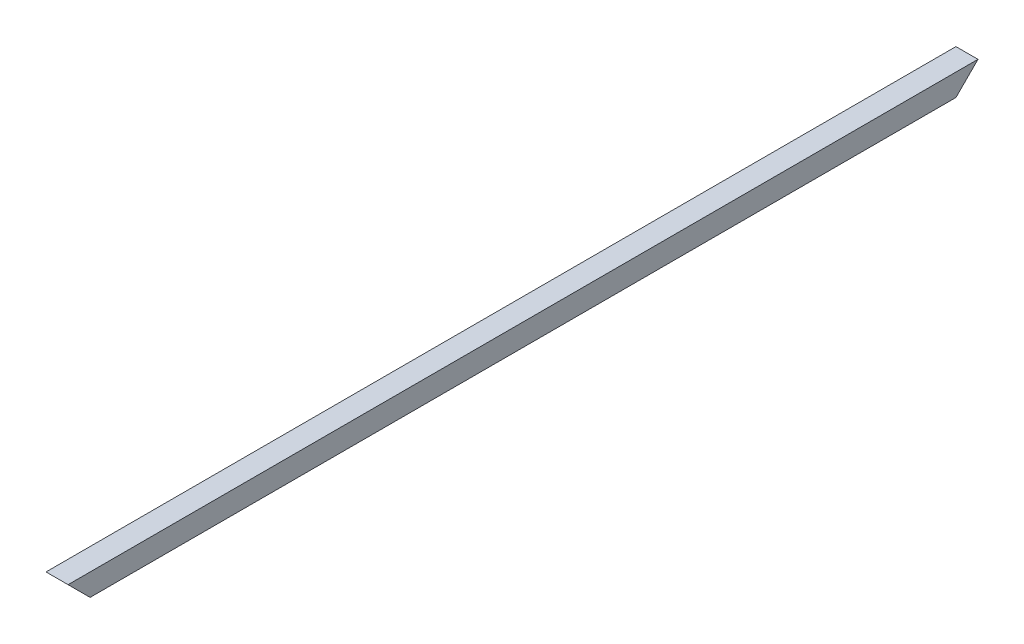
ISO-10303-21;
HEADER;
FILE_DESCRIPTION(('STEP AP214'),'2;1');
FILE_NAME('part.step','',(''),(''),'','','');
FILE_SCHEMA(('AUTOMOTIVE_DESIGN { 1 0 10303 214 1 1 1 1 }'));
ENDSEC;
DATA;
#1=APPLICATION_CONTEXT('core data for automotive mechanical design processes');
#2=APPLICATION_PROTOCOL_DEFINITION('international standard','automotive_design',2000,#1);
#3=PRODUCT_CONTEXT('',#1,'mechanical');
#4=PRODUCT('Part','Part','',(#3));
#5=PRODUCT_RELATED_PRODUCT_CATEGORY('part','',(#4));
#6=PRODUCT_DEFINITION_FORMATION('','',#4);
#7=PRODUCT_DEFINITION_CONTEXT('part definition',#1,'design');
#8=PRODUCT_DEFINITION('design','',#6,#7);
#9=PRODUCT_DEFINITION_SHAPE('','',#8);
#10=(LENGTH_UNIT() NAMED_UNIT(*) SI_UNIT(.MILLI.,.METRE.));
#11=(NAMED_UNIT(*) PLANE_ANGLE_UNIT() SI_UNIT($,.RADIAN.));
#12=(NAMED_UNIT(*) SI_UNIT($,.STERADIAN.) SOLID_ANGLE_UNIT());
#13=UNCERTAINTY_MEASURE_WITH_UNIT(LENGTH_MEASURE(1.E-05),#10,'distance_accuracy_value','');
#14=(GEOMETRIC_REPRESENTATION_CONTEXT(3) GLOBAL_UNCERTAINTY_ASSIGNED_CONTEXT((#13)) GLOBAL_UNIT_ASSIGNED_CONTEXT((#10,
#11,#12)) REPRESENTATION_CONTEXT('',''));
#15=CARTESIAN_POINT('',(0.,0.,0.));
#16=DIRECTION('',(0.,0.,1.));
#17=DIRECTION('',(1.,0.,0.));
#18=AXIS2_PLACEMENT_3D('',#15,#16,#17);
#19=CARTESIAN_POINT('',(-40.,1631.5,-1650.));
#20=DIRECTION('',(-1.,0.,0.));
#21=DIRECTION('',(0.,0.,1.));
#22=AXIS2_PLACEMENT_3D('',#19,#20,#21);
#23=PLANE('',#22);
#24=DIRECTION('',(0.,-0.707106781186548,0.707106781186548));
#25=VECTOR('',#24,1.);
#26=CARTESIAN_POINT('',(-40.,1591.5,-1610.));
#27=LINE('',#26,#25);
#28=CARTESIAN_POINT('',(-40.,1631.5,-1650.));
#29=VERTEX_POINT('',#28);
#30=CARTESIAN_POINT('',(-40.,1591.5,-1610.));
#31=VERTEX_POINT('',#30);
#32=EDGE_CURVE('E107',#29,#31,#27,.T.);
#33=ORIENTED_EDGE('',*,*,#32,.T.);
#34=DIRECTION('',(0.,0.,1.));
#35=VECTOR('',#34,1.);
#36=CARTESIAN_POINT('',(-40.,1591.5,-1650.));
#37=LINE('',#36,#35);
#38=CARTESIAN_POINT('',(-40.,1591.5,-40.0000000000001));
#39=VERTEX_POINT('',#38);
#40=EDGE_CURVE('E115',#31,#39,#37,.T.);
#41=ORIENTED_EDGE('',*,*,#40,.T.);
#42=DIRECTION('',(0.,0.707106781186547,0.707106781186548));
#43=VECTOR('',#42,1.);
#44=CARTESIAN_POINT('',(-40.,1591.5,-40.0000000000001));
#45=LINE('',#44,#43);
#46=CARTESIAN_POINT('',(-40.,1631.5,0.));
#47=VERTEX_POINT('',#46);
#48=EDGE_CURVE('E153',#39,#47,#45,.T.);
#49=ORIENTED_EDGE('',*,*,#48,.T.);
#50=DIRECTION('',(0.,0.,1.));
#51=VECTOR('',#50,1.);
#52=CARTESIAN_POINT('',(-40.,1631.5,-1650.));
#53=LINE('',#52,#51);
#54=EDGE_CURVE('E123',#29,#47,#53,.T.);
#55=ORIENTED_EDGE('',*,*,#54,.F.);
#56=EDGE_LOOP('',(#33,#41,#49,#55));
#57=FACE_BOUND('',#56,.T.);
#58=ADVANCED_FACE('F32',(#57),#23,.T.);
#59=CARTESIAN_POINT('',(-40.,1631.5,-1650.));
#60=DIRECTION('',(0.,1.,0.));
#61=DIRECTION('',(0.,0.,1.));
#62=AXIS2_PLACEMENT_3D('',#59,#60,#61);
#63=PLANE('',#62);
#64=DIRECTION('',(-1.,0.,0.));
#65=VECTOR('',#64,1.);
#66=CARTESIAN_POINT('',(-40.,1631.5,0.));
#67=LINE('',#66,#65);
#68=CARTESIAN_POINT('',(0.,1631.5,0.));
#69=VERTEX_POINT('',#68);
#70=EDGE_CURVE('E135',#69,#47,#67,.T.);
#71=ORIENTED_EDGE('',*,*,#70,.F.);
#72=DIRECTION('',(0.,0.,1.));
#73=VECTOR('',#72,1.);
#74=CARTESIAN_POINT('',(0.,1631.5,-1650.));
#75=LINE('',#74,#73);
#76=CARTESIAN_POINT('',(0.,1631.5,-1650.));
#77=VERTEX_POINT('',#76);
#78=EDGE_CURVE('E121',#77,#69,#75,.T.);
#79=ORIENTED_EDGE('',*,*,#78,.F.);
#80=DIRECTION('',(-1.,0.,0.));
#81=VECTOR('',#80,1.);
#82=CARTESIAN_POINT('',(-40.,1631.5,-1650.));
#83=LINE('',#82,#81);
#84=EDGE_CURVE('E102',#77,#29,#83,.T.);
#85=ORIENTED_EDGE('',*,*,#84,.T.);
#86=ORIENTED_EDGE('',*,*,#54,.T.);
#87=EDGE_LOOP('',(#71,#79,#85,#86));
#88=FACE_BOUND('',#87,.T.);
#89=ADVANCED_FACE('F166',(#88),#63,.T.);
#90=CARTESIAN_POINT('',(0.,1631.5,-1650.));
#91=DIRECTION('',(1.,0.,0.));
#92=DIRECTION('',(0.,0.,-1.));
#93=AXIS2_PLACEMENT_3D('',#90,#91,#92);
#94=PLANE('',#93);
#95=DIRECTION('',(0.,-0.707106781186547,0.707106781186547));
#96=VECTOR('',#95,1.);
#97=CARTESIAN_POINT('',(0.,1591.5,-1610.));
#98=LINE('',#97,#96);
#99=CARTESIAN_POINT('',(0.,1591.5,-1610.));
#100=VERTEX_POINT('',#99);
#101=EDGE_CURVE('E96',#77,#100,#98,.T.);
#102=ORIENTED_EDGE('',*,*,#101,.F.);
#103=ORIENTED_EDGE('',*,*,#78,.T.);
#104=DIRECTION('',(0.,0.707106781186547,0.707106781186548));
#105=VECTOR('',#104,1.);
#106=CARTESIAN_POINT('',(0.,1591.5,-40.0000000000001));
#107=LINE('',#106,#105);
#108=CARTESIAN_POINT('',(0.,1591.5,-40.0000000000001));
#109=VERTEX_POINT('',#108);
#110=EDGE_CURVE('E120',#109,#69,#107,.T.);
#111=ORIENTED_EDGE('',*,*,#110,.F.);
#112=DIRECTION('',(0.,0.,1.));
#113=VECTOR('',#112,1.);
#114=CARTESIAN_POINT('',(0.,1591.5,-1650.));
#115=LINE('',#114,#113);
#116=EDGE_CURVE('E113',#100,#109,#115,.T.);
#117=ORIENTED_EDGE('',*,*,#116,.F.);
#118=EDGE_LOOP('',(#102,#103,#111,#117));
#119=FACE_BOUND('',#118,.T.);
#120=ADVANCED_FACE('F119',(#119),#94,.T.);
#121=CARTESIAN_POINT('',(-40.,1591.5,-1650.));
#122=DIRECTION('',(0.,-1.,0.));
#123=DIRECTION('',(0.,0.,-1.));
#124=AXIS2_PLACEMENT_3D('',#121,#122,#123);
#125=PLANE('',#124);
#126=DIRECTION('',(1.,0.,0.));
#127=VECTOR('',#126,1.);
#128=CARTESIAN_POINT('',(-96.5685424949239,1591.5,-1610.));
#129=LINE('',#128,#127);
#130=EDGE_CURVE('E99',#31,#100,#129,.T.);
#131=ORIENTED_EDGE('',*,*,#130,.T.);
#132=ORIENTED_EDGE('',*,*,#116,.T.);
#133=DIRECTION('',(1.,0.,0.));
#134=VECTOR('',#133,1.);
#135=CARTESIAN_POINT('',(-96.5685424949239,1591.5,-40.0000000000001));
#136=LINE('',#135,#134);
#137=EDGE_CURVE('E154',#39,#109,#136,.T.);
#138=ORIENTED_EDGE('',*,*,#137,.F.);
#139=ORIENTED_EDGE('',*,*,#40,.F.);
#140=EDGE_LOOP('',(#131,#132,#138,#139));
#141=FACE_BOUND('',#140,.T.);
#142=ADVANCED_FACE('F111',(#141),#125,.T.);
#143=CARTESIAN_POINT('',(-38.,1629.5,-1650.));
#144=DIRECTION('',(-1.,0.,0.));
#145=DIRECTION('',(0.,0.,1.));
#146=AXIS2_PLACEMENT_3D('',#143,#144,#145);
#147=PLANE('',#146);
#148=DIRECTION('',(0.,0.,1.));
#149=VECTOR('',#148,1.);
#150=CARTESIAN_POINT('',(-38.,1593.5,-1650.));
#151=LINE('',#150,#149);
#152=CARTESIAN_POINT('',(-38.,1593.5,-1612.));
#153=VERTEX_POINT('',#152);
#154=CARTESIAN_POINT('',(-38.,1593.5,-37.9999999999998));
#155=VERTEX_POINT('',#154);
#156=EDGE_CURVE('E139',#153,#155,#151,.T.);
#157=ORIENTED_EDGE('',*,*,#156,.F.);
#158=DIRECTION('',(0.,0.707106781186548,-0.707106781186548));
#159=VECTOR('',#158,1.);
#160=CARTESIAN_POINT('',(-38.,1630.5,-1649.));
#161=LINE('',#160,#159);
#162=CARTESIAN_POINT('',(-38.,1629.5,-1648.));
#163=VERTEX_POINT('',#162);
#164=EDGE_CURVE('E46',#153,#163,#161,.T.);
#165=ORIENTED_EDGE('',*,*,#164,.T.);
#166=DIRECTION('',(0.,0.,1.));
#167=VECTOR('',#166,1.);
#168=CARTESIAN_POINT('',(-38.,1629.5,-1650.));
#169=LINE('',#168,#167);
#170=CARTESIAN_POINT('',(-38.,1629.5,-1.99999999999978));
#171=VERTEX_POINT('',#170);
#172=EDGE_CURVE('E137',#163,#171,#169,.T.);
#173=ORIENTED_EDGE('',*,*,#172,.T.);
#174=DIRECTION('',(0.,-0.707106781186547,-0.707106781186548));
#175=VECTOR('',#174,1.);
#176=CARTESIAN_POINT('',(-38.,805.5,-826.000000000001));
#177=LINE('',#176,#175);
#178=EDGE_CURVE('E141',#171,#155,#177,.T.);
#179=ORIENTED_EDGE('',*,*,#178,.T.);
#180=EDGE_LOOP('',(#157,#165,#173,#179));
#181=FACE_BOUND('',#180,.T.);
#182=ADVANCED_FACE('F182',(#181),#147,.F.);
#183=CARTESIAN_POINT('',(-38.,1629.5,-1650.));
#184=DIRECTION('',(0.,1.,0.));
#185=DIRECTION('',(0.,0.,1.));
#186=AXIS2_PLACEMENT_3D('',#183,#184,#185);
#187=PLANE('',#186);
#188=ORIENTED_EDGE('',*,*,#172,.F.);
#189=DIRECTION('',(1.,0.,0.));
#190=VECTOR('',#189,1.);
#191=CARTESIAN_POINT('',(-38.,1629.5,-1648.));
#192=LINE('',#191,#190);
#193=CARTESIAN_POINT('',(-2.,1629.5,-1648.));
#194=VERTEX_POINT('',#193);
#195=EDGE_CURVE('E160',#163,#194,#192,.T.);
#196=ORIENTED_EDGE('',*,*,#195,.T.);
#197=DIRECTION('',(0.,0.,1.));
#198=VECTOR('',#197,1.);
#199=CARTESIAN_POINT('',(-2.,1629.5,-1650.));
#200=LINE('',#199,#198);
#201=CARTESIAN_POINT('',(-2.,1629.5,-2.00000000000011));
#202=VERTEX_POINT('',#201);
#203=EDGE_CURVE('E143',#194,#202,#200,.T.);
#204=ORIENTED_EDGE('',*,*,#203,.T.);
#205=DIRECTION('',(-1.,0.,0.));
#206=VECTOR('',#205,1.);
#207=CARTESIAN_POINT('',(-38.,1629.5,-1.99999999999978));
#208=LINE('',#207,#206);
#209=EDGE_CURVE('E148',#202,#171,#208,.T.);
#210=ORIENTED_EDGE('',*,*,#209,.T.);
#211=EDGE_LOOP('',(#188,#196,#204,#210));
#212=FACE_BOUND('',#211,.T.);
#213=ADVANCED_FACE('F179',(#212),#187,.F.);
#214=CARTESIAN_POINT('',(-2.,1629.5,-1650.));
#215=DIRECTION('',(1.,0.,0.));
#216=DIRECTION('',(0.,1.,0.));
#217=AXIS2_PLACEMENT_3D('',#214,#215,#216);
#218=PLANE('',#217);
#219=ORIENTED_EDGE('',*,*,#203,.F.);
#220=DIRECTION('',(0.,-0.707106781186548,0.707106781186548));
#221=VECTOR('',#220,1.);
#222=CARTESIAN_POINT('',(-2.,1630.5,-1649.));
#223=LINE('',#222,#221);
#224=CARTESIAN_POINT('',(-2.,1593.5,-1612.));
#225=VERTEX_POINT('',#224);
#226=EDGE_CURVE('E116',#194,#225,#223,.T.);
#227=ORIENTED_EDGE('',*,*,#226,.T.);
#228=DIRECTION('',(0.,0.,1.));
#229=VECTOR('',#228,1.);
#230=CARTESIAN_POINT('',(-2.,1593.5,-1650.));
#231=LINE('',#230,#229);
#232=CARTESIAN_POINT('',(-2.,1593.5,-37.9999999999998));
#233=VERTEX_POINT('',#232);
#234=EDGE_CURVE('E53',#225,#233,#231,.T.);
#235=ORIENTED_EDGE('',*,*,#234,.T.);
#236=DIRECTION('',(0.,0.707106781186547,0.707106781186548));
#237=VECTOR('',#236,1.);
#238=CARTESIAN_POINT('',(-2.00000000000004,805.5,-826.000000000001));
#239=LINE('',#238,#237);
#240=EDGE_CURVE('E151',#233,#202,#239,.T.);
#241=ORIENTED_EDGE('',*,*,#240,.T.);
#242=EDGE_LOOP('',(#219,#227,#235,#241));
#243=FACE_BOUND('',#242,.T.);
#244=ADVANCED_FACE('F178',(#243),#218,.F.);
#245=CARTESIAN_POINT('',(-38.,1593.5,-1650.));
#246=DIRECTION('',(0.,-1.,0.));
#247=DIRECTION('',(0.,0.,-1.));
#248=AXIS2_PLACEMENT_3D('',#245,#246,#247);
#249=PLANE('',#248);
#250=ORIENTED_EDGE('',*,*,#234,.F.);
#251=DIRECTION('',(-1.,0.,0.));
#252=VECTOR('',#251,1.);
#253=CARTESIAN_POINT('',(-38.,1593.5,-1612.));
#254=LINE('',#253,#252);
#255=EDGE_CURVE('E11',#225,#153,#254,.T.);
#256=ORIENTED_EDGE('',*,*,#255,.T.);
#257=ORIENTED_EDGE('',*,*,#156,.T.);
#258=DIRECTION('',(1.,0.,0.));
#259=VECTOR('',#258,1.);
#260=CARTESIAN_POINT('',(-38.,1593.5,-37.9999999999998));
#261=LINE('',#260,#259);
#262=EDGE_CURVE('E39',#155,#233,#261,.T.);
#263=ORIENTED_EDGE('',*,*,#262,.T.);
#264=EDGE_LOOP('',(#250,#256,#257,#263));
#265=FACE_BOUND('',#264,.T.);
#266=ADVANCED_FACE('F171',(#265),#249,.F.);
#267=CARTESIAN_POINT('',(-96.5685424949239,1591.5,-40.0000000000001));
#268=DIRECTION('',(0.,0.707106781186548,-0.707106781186547));
#269=DIRECTION('',(0.,0.707106781186547,0.707106781186548));
#270=AXIS2_PLACEMENT_3D('',#267,#268,#269);
#271=PLANE('',#270);
#272=ORIENTED_EDGE('',*,*,#137,.T.);
#273=ORIENTED_EDGE('',*,*,#110,.T.);
#274=ORIENTED_EDGE('',*,*,#70,.T.);
#275=ORIENTED_EDGE('',*,*,#48,.F.);
#276=EDGE_LOOP('',(#272,#273,#274,#275));
#277=FACE_BOUND('',#276,.T.);
#278=ORIENTED_EDGE('',*,*,#209,.F.);
#279=ORIENTED_EDGE('',*,*,#240,.F.);
#280=ORIENTED_EDGE('',*,*,#262,.F.);
#281=ORIENTED_EDGE('',*,*,#178,.F.);
#282=EDGE_LOOP('',(#278,#279,#280,#281));
#283=FACE_BOUND('',#282,.T.);
#284=ADVANCED_FACE('F168',(#277,#283),#271,.F.);
#285=CARTESIAN_POINT('',(-96.5685424949239,1591.5,-1610.));
#286=DIRECTION('',(0.,0.707106781186548,0.707106781186548));
#287=DIRECTION('',(0.,-0.707106781186548,0.707106781186548));
#288=AXIS2_PLACEMENT_3D('',#285,#286,#287);
#289=PLANE('',#288);
#290=ORIENTED_EDGE('',*,*,#84,.F.);
#291=ORIENTED_EDGE('',*,*,#101,.T.);
#292=ORIENTED_EDGE('',*,*,#130,.F.);
#293=ORIENTED_EDGE('',*,*,#32,.F.);
#294=EDGE_LOOP('',(#290,#291,#292,#293));
#295=FACE_BOUND('',#294,.T.);
#296=ORIENTED_EDGE('',*,*,#255,.F.);
#297=ORIENTED_EDGE('',*,*,#226,.F.);
#298=ORIENTED_EDGE('',*,*,#195,.F.);
#299=ORIENTED_EDGE('',*,*,#164,.F.);
#300=EDGE_LOOP('',(#296,#297,#298,#299));
#301=FACE_BOUND('',#300,.T.);
#302=ADVANCED_FACE('F98',(#295,#301),#289,.F.);
#303=CLOSED_SHELL('',(#58,#89,#120,#142,#182,#213,#244,#266,#284,#302));
#304=MANIFOLD_SOLID_BREP('B2',#303);
#305=ADVANCED_BREP_SHAPE_REPRESENTATION('',(#18,#304),#14);
#306=SHAPE_DEFINITION_REPRESENTATION(#9,#305);
ENDSEC;
END-ISO-10303-21;
